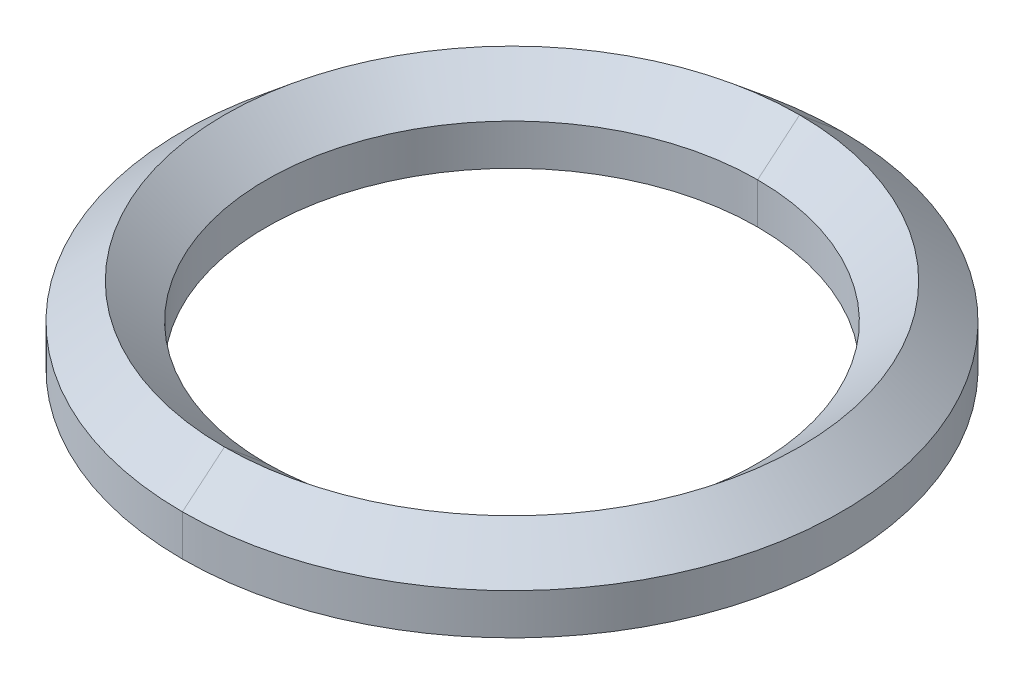
ISO-10303-21;
HEADER;
FILE_DESCRIPTION(('STEP AP214'),'2;1');
FILE_NAME('part.step','',(''),(''),'','','');
FILE_SCHEMA(('AUTOMOTIVE_DESIGN { 1 0 10303 214 1 1 1 1 }'));
ENDSEC;
DATA;
#1=APPLICATION_CONTEXT('core data for automotive mechanical design processes');
#2=APPLICATION_PROTOCOL_DEFINITION('international standard','automotive_design',2000,#1);
#3=PRODUCT_CONTEXT('',#1,'mechanical');
#4=PRODUCT('Part','Part','',(#3));
#5=PRODUCT_RELATED_PRODUCT_CATEGORY('part','',(#4));
#6=PRODUCT_DEFINITION_FORMATION('','',#4);
#7=PRODUCT_DEFINITION_CONTEXT('part definition',#1,'design');
#8=PRODUCT_DEFINITION('design','',#6,#7);
#9=PRODUCT_DEFINITION_SHAPE('','',#8);
#10=(LENGTH_UNIT() NAMED_UNIT(*) SI_UNIT(.MILLI.,.METRE.));
#11=(NAMED_UNIT(*) PLANE_ANGLE_UNIT() SI_UNIT($,.RADIAN.));
#12=(NAMED_UNIT(*) SI_UNIT($,.STERADIAN.) SOLID_ANGLE_UNIT());
#13=UNCERTAINTY_MEASURE_WITH_UNIT(LENGTH_MEASURE(1.E-05),#10,'distance_accuracy_value','');
#14=(GEOMETRIC_REPRESENTATION_CONTEXT(3) GLOBAL_UNCERTAINTY_ASSIGNED_CONTEXT((#13)) GLOBAL_UNIT_ASSIGNED_CONTEXT((#10,
#11,#12)) REPRESENTATION_CONTEXT('',''));
#15=CARTESIAN_POINT('',(0.,0.,0.));
#16=DIRECTION('',(0.,0.,1.));
#17=DIRECTION('',(1.,0.,0.));
#18=AXIS2_PLACEMENT_3D('',#15,#16,#17);
#19=CARTESIAN_POINT('',(-2.90698826646719,4.21171873202199,54.127124258992));
#20=DIRECTION('',(0.,1.,0.));
#21=DIRECTION('',(0.,0.,-1.));
#22=AXIS2_PLACEMENT_3D('',#19,#20,#21);
#23=CONICAL_SURFACE('',#22,6.,0.785398162500002);
#24=DIRECTION('',(0.,0.707106781186546,-0.707106781186549));
#25=VECTOR('',#24,1.);
#26=CARTESIAN_POINT('',(-2.90698826646719,4.21171873202199,48.127124258992));
#27=LINE('',#26,#25);
#28=CARTESIAN_POINT('',(-2.90698826646719,4.21171873202199,48.127124258992));
#29=VERTEX_POINT('',#28);
#30=CARTESIAN_POINT('',(-2.90698826646719,5.23671873202199,47.102124258992));
#31=VERTEX_POINT('',#30);
#32=EDGE_CURVE('E179',#29,#31,#27,.T.);
#33=ORIENTED_EDGE('',*,*,#32,.F.);
#34=CARTESIAN_POINT('',(-2.90698826646719,4.21171873202199,54.127124258992));
#35=DIRECTION('',(0.,-1.,0.));
#36=DIRECTION('',(0.,0.,-1.));
#37=AXIS2_PLACEMENT_3D('',#34,#35,#36);
#38=CIRCLE('',#37,6.);
#39=CARTESIAN_POINT('',(-2.90698826646719,4.21171873202199,60.1271242589921));
#40=VERTEX_POINT('',#39);
#41=EDGE_CURVE('E152',#40,#29,#38,.T.);
#42=ORIENTED_EDGE('',*,*,#41,.F.);
#43=DIRECTION('',(0.,0.707106781186546,0.707106781186549));
#44=VECTOR('',#43,1.);
#45=CARTESIAN_POINT('',(-2.90698826646719,4.21171873202199,60.1271242589921));
#46=LINE('',#45,#44);
#47=CARTESIAN_POINT('',(-2.90698826646719,5.23671873202199,61.1521242589921));
#48=VERTEX_POINT('',#47);
#49=EDGE_CURVE('E128',#40,#48,#46,.T.);
#50=ORIENTED_EDGE('',*,*,#49,.T.);
#51=CARTESIAN_POINT('',(-2.90698826646719,5.23671873202199,54.127124258992));
#52=DIRECTION('',(0.,-1.,0.));
#53=DIRECTION('',(0.,0.,-1.));
#54=AXIS2_PLACEMENT_3D('',#51,#52,#53);
#55=CIRCLE('',#54,7.025);
#56=EDGE_CURVE('E125',#48,#31,#55,.T.);
#57=ORIENTED_EDGE('',*,*,#56,.T.);
#58=EDGE_LOOP('',(#33,#42,#50,#57));
#59=FACE_BOUND('',#58,.T.);
#60=ADVANCED_FACE('F17',(#59),#23,.T.);
#61=CARTESIAN_POINT('',(-2.90698826646719,4.21171873202199,54.127124258992));
#62=DIRECTION('',(0.,-1.,0.));
#63=DIRECTION('',(0.,0.,1.));
#64=AXIS2_PLACEMENT_3D('',#61,#62,#63);
#65=CONICAL_SURFACE('',#64,8.05,0.785398162500002);
#66=DIRECTION('',(0.,-0.707106781186547,0.707106781186548));
#67=VECTOR('',#66,1.);
#68=CARTESIAN_POINT('',(-2.90698826646719,4.21171873202199,62.1771242589921));
#69=LINE('',#68,#67);
#70=CARTESIAN_POINT('',(-2.90698826646719,4.21171873202199,62.1771242589921));
#71=VERTEX_POINT('',#70);
#72=EDGE_CURVE('E127',#48,#71,#69,.T.);
#73=ORIENTED_EDGE('',*,*,#72,.F.);
#74=CARTESIAN_POINT('',(-2.90698826646719,5.23671873202199,54.127124258992));
#75=DIRECTION('',(0.,-1.,0.));
#76=DIRECTION('',(0.,0.,-1.));
#77=AXIS2_PLACEMENT_3D('',#74,#75,#76);
#78=CIRCLE('',#77,7.025);
#79=EDGE_CURVE('E185',#31,#48,#78,.T.);
#80=ORIENTED_EDGE('',*,*,#79,.F.);
#81=DIRECTION('',(0.,-0.707106781186547,-0.707106781186548));
#82=VECTOR('',#81,1.);
#83=CARTESIAN_POINT('',(-2.90698826646719,4.21171873202199,46.0771242589921));
#84=LINE('',#83,#82);
#85=CARTESIAN_POINT('',(-2.90698826646719,4.21171873202199,46.0771242589921));
#86=VERTEX_POINT('',#85);
#87=EDGE_CURVE('E114',#31,#86,#84,.T.);
#88=ORIENTED_EDGE('',*,*,#87,.T.);
#89=CARTESIAN_POINT('',(-2.90698826646719,4.21171873202199,54.127124258992));
#90=DIRECTION('',(0.,-1.,0.));
#91=DIRECTION('',(0.,0.,-1.));
#92=AXIS2_PLACEMENT_3D('',#89,#90,#91);
#93=CIRCLE('',#92,8.05);
#94=EDGE_CURVE('E109',#86,#71,#93,.T.);
#95=ORIENTED_EDGE('',*,*,#94,.T.);
#96=EDGE_LOOP('',(#73,#80,#88,#95));
#97=FACE_BOUND('',#96,.T.);
#98=ADVANCED_FACE('F19',(#97),#65,.F.);
#99=CARTESIAN_POINT('',(-2.90698826646719,3.41171873202199,54.127124258992));
#100=DIRECTION('',(0.,-1.,0.));
#101=DIRECTION('',(0.,0.,1.));
#102=AXIS2_PLACEMENT_3D('',#99,#100,#101);
#103=CYLINDRICAL_SURFACE('',#102,8.05);
#104=DIRECTION('',(0.,-1.,0.));
#105=VECTOR('',#104,1.);
#106=CARTESIAN_POINT('',(-2.90698826646719,3.41171873202199,62.1771242589921));
#107=LINE('',#106,#105);
#108=CARTESIAN_POINT('',(-2.90698826646719,5.21171873202199,62.1771242589921));
#109=VERTEX_POINT('',#108);
#110=EDGE_CURVE('E101',#109,#71,#107,.T.);
#111=ORIENTED_EDGE('',*,*,#110,.F.);
#112=CARTESIAN_POINT('',(-2.90698826646719,5.21171873202199,54.127124258992));
#113=DIRECTION('',(0.,-1.,0.));
#114=DIRECTION('',(0.,0.,-1.));
#115=AXIS2_PLACEMENT_3D('',#112,#113,#114);
#116=CIRCLE('',#115,8.05);
#117=CARTESIAN_POINT('',(-2.90698826646719,5.21171873202199,46.0771242589921));
#118=VERTEX_POINT('',#117);
#119=EDGE_CURVE('E11',#109,#118,#116,.T.);
#120=ORIENTED_EDGE('',*,*,#119,.T.);
#121=DIRECTION('',(0.,-1.,0.));
#122=VECTOR('',#121,1.);
#123=CARTESIAN_POINT('',(-2.90698826646719,3.41171873202199,46.0771242589921));
#124=LINE('',#123,#122);
#125=EDGE_CURVE('E112',#118,#86,#124,.T.);
#126=ORIENTED_EDGE('',*,*,#125,.T.);
#127=CARTESIAN_POINT('',(-2.90698826646719,4.21171873202199,54.127124258992));
#128=DIRECTION('',(0.,-1.,0.));
#129=DIRECTION('',(0.,0.,-1.));
#130=AXIS2_PLACEMENT_3D('',#127,#128,#129);
#131=CIRCLE('',#130,8.05);
#132=EDGE_CURVE('E104',#71,#86,#131,.T.);
#133=ORIENTED_EDGE('',*,*,#132,.F.);
#134=EDGE_LOOP('',(#111,#120,#126,#133));
#135=FACE_BOUND('',#134,.T.);
#136=ADVANCED_FACE('F102',(#135),#103,.T.);
#137=CARTESIAN_POINT('',(-2.90698826646719,5.21171873202199,54.127124258992));
#138=DIRECTION('',(0.,-1.,0.));
#139=DIRECTION('',(0.,0.,1.));
#140=AXIS2_PLACEMENT_3D('',#137,#138,#139);
#141=CONICAL_SURFACE('',#140,8.05,0.872664625000001);
#142=DIRECTION('',(0.,-0.642787609686538,0.766044443118979));
#143=VECTOR('',#142,1.);
#144=CARTESIAN_POINT('',(-2.90698826646719,5.21171873202199,62.1771242589921));
#145=LINE('',#144,#143);
#146=CARTESIAN_POINT('',(-2.90698826646719,6.0717958539787,61.1521242589921));
#147=VERTEX_POINT('',#146);
#148=EDGE_CURVE('E83',#147,#109,#145,.T.);
#149=ORIENTED_EDGE('',*,*,#148,.F.);
#150=CARTESIAN_POINT('',(-2.90698826646719,6.0717958539787,54.127124258992));
#151=DIRECTION('',(0.,-1.,0.));
#152=DIRECTION('',(0.,0.,-1.));
#153=AXIS2_PLACEMENT_3D('',#150,#151,#152);
#154=CIRCLE('',#153,7.025);
#155=CARTESIAN_POINT('',(-2.90698826646719,6.0717958539787,47.102124258992));
#156=VERTEX_POINT('',#155);
#157=EDGE_CURVE('E142',#147,#156,#154,.T.);
#158=ORIENTED_EDGE('',*,*,#157,.T.);
#159=DIRECTION('',(0.,-0.642787609686538,-0.766044443118979));
#160=VECTOR('',#159,1.);
#161=CARTESIAN_POINT('',(-2.90698826646719,5.21171873202199,46.0771242589921));
#162=LINE('',#161,#160);
#163=EDGE_CURVE('E86',#156,#118,#162,.T.);
#164=ORIENTED_EDGE('',*,*,#163,.T.);
#165=ORIENTED_EDGE('',*,*,#119,.F.);
#166=EDGE_LOOP('',(#149,#158,#164,#165));
#167=FACE_BOUND('',#166,.T.);
#168=ADVANCED_FACE('F82',(#167),#141,.T.);
#169=CARTESIAN_POINT('',(-2.90698826646719,5.21171873202199,54.127124258992));
#170=DIRECTION('',(0.,1.,0.));
#171=DIRECTION('',(0.,0.,-1.));
#172=AXIS2_PLACEMENT_3D('',#169,#170,#171);
#173=CONICAL_SURFACE('',#172,6.,0.872664625000001);
#174=DIRECTION('',(0.,0.642787609686538,-0.766044443118979));
#175=VECTOR('',#174,1.);
#176=CARTESIAN_POINT('',(-2.90698826646719,5.21171873202199,48.127124258992));
#177=LINE('',#176,#175);
#178=CARTESIAN_POINT('',(-2.90698826646719,5.21171873202199,48.127124258992));
#179=VERTEX_POINT('',#178);
#180=EDGE_CURVE('E138',#179,#156,#177,.T.);
#181=ORIENTED_EDGE('',*,*,#180,.F.);
#182=CARTESIAN_POINT('',(-2.90698826646719,5.21171873202199,54.127124258992));
#183=DIRECTION('',(0.,-1.,0.));
#184=DIRECTION('',(0.,0.,-1.));
#185=AXIS2_PLACEMENT_3D('',#182,#183,#184);
#186=CIRCLE('',#185,6.);
#187=CARTESIAN_POINT('',(-2.90698826646719,5.21171873202199,60.1271242589921));
#188=VERTEX_POINT('',#187);
#189=EDGE_CURVE('E27',#179,#188,#186,.T.);
#190=ORIENTED_EDGE('',*,*,#189,.T.);
#191=DIRECTION('',(0.,0.642787609686538,0.766044443118979));
#192=VECTOR('',#191,1.);
#193=CARTESIAN_POINT('',(-2.90698826646719,5.21171873202199,60.1271242589921));
#194=LINE('',#193,#192);
#195=EDGE_CURVE('E145',#188,#147,#194,.T.);
#196=ORIENTED_EDGE('',*,*,#195,.T.);
#197=CARTESIAN_POINT('',(-2.90698826646719,6.0717958539787,54.127124258992));
#198=DIRECTION('',(0.,-1.,0.));
#199=DIRECTION('',(0.,0.,-1.));
#200=AXIS2_PLACEMENT_3D('',#197,#198,#199);
#201=CIRCLE('',#200,7.025);
#202=EDGE_CURVE('E96',#156,#147,#201,.T.);
#203=ORIENTED_EDGE('',*,*,#202,.F.);
#204=EDGE_LOOP('',(#181,#190,#196,#203));
#205=FACE_BOUND('',#204,.T.);
#206=ADVANCED_FACE('F162',(#205),#173,.F.);
#207=CARTESIAN_POINT('',(-2.90698826646719,3.41171873202199,54.127124258992));
#208=DIRECTION('',(0.,-1.,0.));
#209=DIRECTION('',(0.,0.,1.));
#210=AXIS2_PLACEMENT_3D('',#207,#208,#209);
#211=CYLINDRICAL_SURFACE('',#210,6.);
#212=DIRECTION('',(0.,-1.,0.));
#213=VECTOR('',#212,1.);
#214=CARTESIAN_POINT('',(-2.90698826646719,3.41171873202199,60.1271242589921));
#215=LINE('',#214,#213);
#216=EDGE_CURVE('E148',#188,#40,#215,.T.);
#217=ORIENTED_EDGE('',*,*,#216,.F.);
#218=ORIENTED_EDGE('',*,*,#189,.F.);
#219=DIRECTION('',(0.,-1.,0.));
#220=VECTOR('',#219,1.);
#221=CARTESIAN_POINT('',(-2.90698826646719,3.41171873202199,48.127124258992));
#222=LINE('',#221,#220);
#223=EDGE_CURVE('E156',#179,#29,#222,.T.);
#224=ORIENTED_EDGE('',*,*,#223,.T.);
#225=CARTESIAN_POINT('',(-2.90698826646719,4.21171873202199,54.127124258992));
#226=DIRECTION('',(0.,-1.,0.));
#227=DIRECTION('',(0.,0.,-1.));
#228=AXIS2_PLACEMENT_3D('',#225,#226,#227);
#229=CIRCLE('',#228,6.);
#230=EDGE_CURVE('E168',#29,#40,#229,.T.);
#231=ORIENTED_EDGE('',*,*,#230,.T.);
#232=EDGE_LOOP('',(#217,#218,#224,#231));
#233=FACE_BOUND('',#232,.T.);
#234=ADVANCED_FACE('F166',(#233),#211,.F.);
#235=CARTESIAN_POINT('',(-2.90698826646719,3.41171873202199,54.127124258992));
#236=DIRECTION('',(0.,-1.,0.));
#237=DIRECTION('',(0.,0.,1.));
#238=AXIS2_PLACEMENT_3D('',#235,#236,#237);
#239=CYLINDRICAL_SURFACE('',#238,6.);
#240=CARTESIAN_POINT('',(-2.90698826646719,5.21171873202199,54.127124258992));
#241=DIRECTION('',(0.,-1.,0.));
#242=DIRECTION('',(0.,0.,-1.));
#243=AXIS2_PLACEMENT_3D('',#240,#241,#242);
#244=CIRCLE('',#243,6.);
#245=EDGE_CURVE('E132',#188,#179,#244,.T.);
#246=ORIENTED_EDGE('',*,*,#245,.F.);
#247=ORIENTED_EDGE('',*,*,#216,.T.);
#248=ORIENTED_EDGE('',*,*,#41,.T.);
#249=ORIENTED_EDGE('',*,*,#223,.F.);
#250=EDGE_LOOP('',(#246,#247,#248,#249));
#251=FACE_BOUND('',#250,.T.);
#252=ADVANCED_FACE('F174',(#251),#239,.F.);
#253=CARTESIAN_POINT('',(-2.90698826646719,5.21171873202199,54.127124258992));
#254=DIRECTION('',(0.,1.,0.));
#255=DIRECTION('',(0.,0.,-1.));
#256=AXIS2_PLACEMENT_3D('',#253,#254,#255);
#257=CONICAL_SURFACE('',#256,6.,0.872664625000001);
#258=ORIENTED_EDGE('',*,*,#245,.T.);
#259=ORIENTED_EDGE('',*,*,#180,.T.);
#260=ORIENTED_EDGE('',*,*,#157,.F.);
#261=ORIENTED_EDGE('',*,*,#195,.F.);
#262=EDGE_LOOP('',(#258,#259,#260,#261));
#263=FACE_BOUND('',#262,.T.);
#264=ADVANCED_FACE('F173',(#263),#257,.F.);
#265=CARTESIAN_POINT('',(-2.90698826646719,5.21171873202199,54.127124258992));
#266=DIRECTION('',(0.,-1.,0.));
#267=DIRECTION('',(0.,0.,1.));
#268=AXIS2_PLACEMENT_3D('',#265,#266,#267);
#269=CONICAL_SURFACE('',#268,8.05,0.872664625000001);
#270=ORIENTED_EDGE('',*,*,#202,.T.);
#271=ORIENTED_EDGE('',*,*,#148,.T.);
#272=CARTESIAN_POINT('',(-2.90698826646719,5.21171873202199,54.127124258992));
#273=DIRECTION('',(0.,-1.,0.));
#274=DIRECTION('',(0.,0.,-1.));
#275=AXIS2_PLACEMENT_3D('',#272,#273,#274);
#276=CIRCLE('',#275,8.05);
#277=EDGE_CURVE('E94',#118,#109,#276,.T.);
#278=ORIENTED_EDGE('',*,*,#277,.F.);
#279=ORIENTED_EDGE('',*,*,#163,.F.);
#280=EDGE_LOOP('',(#270,#271,#278,#279));
#281=FACE_BOUND('',#280,.T.);
#282=ADVANCED_FACE('F92',(#281),#269,.T.);
#283=CARTESIAN_POINT('',(-2.90698826646719,3.41171873202199,54.127124258992));
#284=DIRECTION('',(0.,-1.,0.));
#285=DIRECTION('',(0.,0.,1.));
#286=AXIS2_PLACEMENT_3D('',#283,#284,#285);
#287=CYLINDRICAL_SURFACE('',#286,8.05);
#288=ORIENTED_EDGE('',*,*,#277,.T.);
#289=ORIENTED_EDGE('',*,*,#110,.T.);
#290=ORIENTED_EDGE('',*,*,#94,.F.);
#291=ORIENTED_EDGE('',*,*,#125,.F.);
#292=EDGE_LOOP('',(#288,#289,#290,#291));
#293=FACE_BOUND('',#292,.T.);
#294=ADVANCED_FACE('F111',(#293),#287,.T.);
#295=CARTESIAN_POINT('',(-2.90698826646719,4.21171873202199,54.127124258992));
#296=DIRECTION('',(0.,-1.,0.));
#297=DIRECTION('',(0.,0.,1.));
#298=AXIS2_PLACEMENT_3D('',#295,#296,#297);
#299=CONICAL_SURFACE('',#298,8.05,0.785398162500002);
#300=ORIENTED_EDGE('',*,*,#56,.F.);
#301=ORIENTED_EDGE('',*,*,#72,.T.);
#302=ORIENTED_EDGE('',*,*,#132,.T.);
#303=ORIENTED_EDGE('',*,*,#87,.F.);
#304=EDGE_LOOP('',(#300,#301,#302,#303));
#305=FACE_BOUND('',#304,.T.);
#306=ADVANCED_FACE('F203',(#305),#299,.F.);
#307=CARTESIAN_POINT('',(-2.90698826646719,4.21171873202199,54.127124258992));
#308=DIRECTION('',(0.,1.,0.));
#309=DIRECTION('',(0.,0.,-1.));
#310=AXIS2_PLACEMENT_3D('',#307,#308,#309);
#311=CONICAL_SURFACE('',#310,6.,0.785398162500002);
#312=ORIENTED_EDGE('',*,*,#230,.F.);
#313=ORIENTED_EDGE('',*,*,#32,.T.);
#314=ORIENTED_EDGE('',*,*,#79,.T.);
#315=ORIENTED_EDGE('',*,*,#49,.F.);
#316=EDGE_LOOP('',(#312,#313,#314,#315));
#317=FACE_BOUND('',#316,.T.);
#318=ADVANCED_FACE('F187',(#317),#311,.T.);
#319=CLOSED_SHELL('',(#60,#98,#136,#168,#206,#234,#252,#264,#282,#294,#306,#318));
#320=MANIFOLD_SOLID_BREP('B1',#319);
#321=ADVANCED_BREP_SHAPE_REPRESENTATION('',(#18,#320),#14);
#322=SHAPE_DEFINITION_REPRESENTATION(#9,#321);
ENDSEC;
END-ISO-10303-21;
